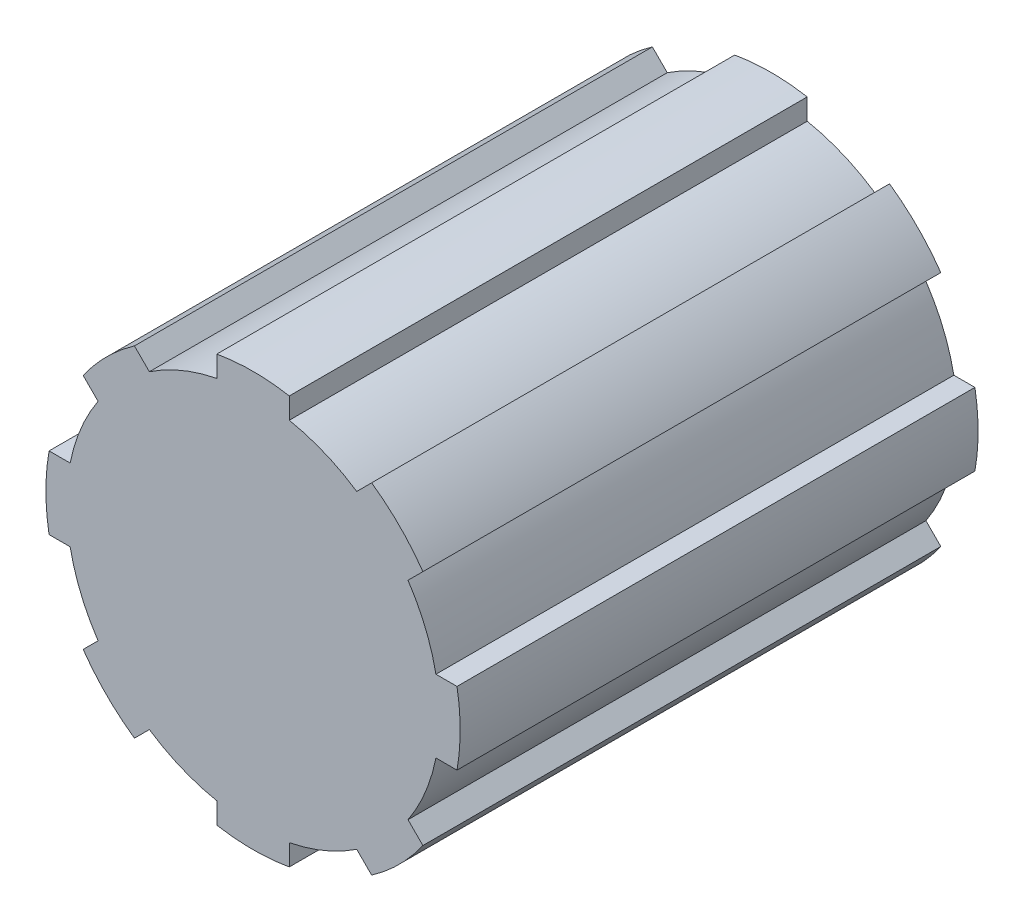
ISO-10303-21;
HEADER;
FILE_DESCRIPTION(('STEP AP214'),'2;1');
FILE_NAME('part.step','',(''),(''),'','','');
FILE_SCHEMA(('AUTOMOTIVE_DESIGN { 1 0 10303 214 1 1 1 1 }'));
ENDSEC;
DATA;
#1=APPLICATION_CONTEXT('core data for automotive mechanical design processes');
#2=APPLICATION_PROTOCOL_DEFINITION('international standard','automotive_design',2000,#1);
#3=PRODUCT_CONTEXT('',#1,'mechanical');
#4=PRODUCT('Part','Part','',(#3));
#5=PRODUCT_RELATED_PRODUCT_CATEGORY('part','',(#4));
#6=PRODUCT_DEFINITION_FORMATION('','',#4);
#7=PRODUCT_DEFINITION_CONTEXT('part definition',#1,'design');
#8=PRODUCT_DEFINITION('design','',#6,#7);
#9=PRODUCT_DEFINITION_SHAPE('','',#8);
#10=(LENGTH_UNIT() NAMED_UNIT(*) SI_UNIT(.MILLI.,.METRE.));
#11=(NAMED_UNIT(*) PLANE_ANGLE_UNIT() SI_UNIT($,.RADIAN.));
#12=(NAMED_UNIT(*) SI_UNIT($,.STERADIAN.) SOLID_ANGLE_UNIT());
#13=UNCERTAINTY_MEASURE_WITH_UNIT(LENGTH_MEASURE(1.E-05),#10,'distance_accuracy_value','');
#14=(GEOMETRIC_REPRESENTATION_CONTEXT(3) GLOBAL_UNCERTAINTY_ASSIGNED_CONTEXT((#13)) GLOBAL_UNIT_ASSIGNED_CONTEXT((#10,
#11,#12)) REPRESENTATION_CONTEXT('',''));
#15=CARTESIAN_POINT('',(0.,0.,0.));
#16=DIRECTION('',(0.,0.,1.));
#17=DIRECTION('',(1.,0.,0.));
#18=AXIS2_PLACEMENT_3D('',#15,#16,#17);
#19=CARTESIAN_POINT('',(0.,0.,-25.));
#20=DIRECTION('',(0.,0.,1.));
#21=DIRECTION('',(1.,0.,0.));
#22=AXIS2_PLACEMENT_3D('',#19,#20,#21);
#23=PLANE('',#22);
#24=CARTESIAN_POINT('',(0.,0.,-25.));
#25=DIRECTION('',(0.,0.,1.));
#26=DIRECTION('',(1.,0.,0.));
#27=AXIS2_PLACEMENT_3D('',#24,#25,#26);
#28=CIRCLE('',#27,18.);
#29=CARTESIAN_POINT('',(10.0101172550309,14.9598647233367,-25.));
#30=VERTEX_POINT('',#29);
#31=CARTESIAN_POINT('',(3.5,17.6564435830096,-25.));
#32=VERTEX_POINT('',#31);
#33=EDGE_CURVE('E527',#30,#32,#28,.T.);
#34=ORIENTED_EDGE('',*,*,#33,.F.);
#35=DIRECTION('',(-0.707106781186549,-0.707106781186546,0.));
#36=VECTOR('',#35,1.);
#37=CARTESIAN_POINT('',(11.4490265814914,16.3987740497972,-25.));
#38=LINE('',#37,#36);
#39=CARTESIAN_POINT('',(11.4490265814914,16.3987740497972,-25.));
#40=VERTEX_POINT('',#39);
#41=EDGE_CURVE('E450',#40,#30,#38,.T.);
#42=ORIENTED_EDGE('',*,*,#41,.F.);
#43=CARTESIAN_POINT('',(0.,0.,-25.));
#44=DIRECTION('',(0.,0.,1.));
#45=DIRECTION('',(0.707106781186546,-0.707106781186549,0.));
#46=AXIS2_PLACEMENT_3D('',#43,#44,#45);
#47=CIRCLE('',#46,20.);
#48=CARTESIAN_POINT('',(16.3987740497973,11.4490265814914,-25.));
#49=VERTEX_POINT('',#48);
#50=EDGE_CURVE('E437',#49,#40,#47,.T.);
#51=ORIENTED_EDGE('',*,*,#50,.F.);
#52=DIRECTION('',(0.707106781186549,0.707106781186546,0.));
#53=VECTOR('',#52,1.);
#54=CARTESIAN_POINT('',(2.47487373415291,-2.47487373415292,-25.));
#55=LINE('',#54,#53);
#56=CARTESIAN_POINT('',(14.9598647233367,10.0101172550308,-25.));
#57=VERTEX_POINT('',#56);
#58=EDGE_CURVE('E442',#57,#49,#55,.T.);
#59=ORIENTED_EDGE('',*,*,#58,.F.);
#60=CARTESIAN_POINT('',(17.6564435830096,3.49999999999994,-25.));
#61=VERTEX_POINT('',#60);
#62=EDGE_CURVE('E530',#61,#57,#28,.T.);
#63=ORIENTED_EDGE('',*,*,#62,.F.);
#64=DIRECTION('',(-1.,0.,0.));
#65=VECTOR('',#64,1.);
#66=CARTESIAN_POINT('',(19.6913686675152,3.49999999999993,-25.));
#67=LINE('',#66,#65);
#68=CARTESIAN_POINT('',(19.6913686675152,3.49999999999993,-25.));
#69=VERTEX_POINT('',#68);
#70=EDGE_CURVE('E428',#69,#61,#67,.T.);
#71=ORIENTED_EDGE('',*,*,#70,.F.);
#72=CARTESIAN_POINT('',(0.,0.,-25.));
#73=DIRECTION('',(0.,0.,1.));
#74=DIRECTION('',(0.,-1.,0.));
#75=AXIS2_PLACEMENT_3D('',#72,#73,#74);
#76=CIRCLE('',#75,20.);
#77=CARTESIAN_POINT('',(19.6913686675152,-3.50000000000007,-25.));
#78=VERTEX_POINT('',#77);
#79=EDGE_CURVE('E415',#78,#69,#76,.T.);
#80=ORIENTED_EDGE('',*,*,#79,.F.);
#81=DIRECTION('',(1.,0.,0.));
#82=VECTOR('',#81,1.);
#83=CARTESIAN_POINT('',(0.,-3.5,-25.));
#84=LINE('',#83,#82);
#85=CARTESIAN_POINT('',(17.6564435830096,-3.50000000000006,-25.));
#86=VERTEX_POINT('',#85);
#87=EDGE_CURVE('E420',#86,#78,#84,.T.);
#88=ORIENTED_EDGE('',*,*,#87,.F.);
#89=CARTESIAN_POINT('',(14.9598647233366,-10.0101172550309,-25.));
#90=VERTEX_POINT('',#89);
#91=EDGE_CURVE('E531',#90,#86,#28,.T.);
#92=ORIENTED_EDGE('',*,*,#91,.F.);
#93=DIRECTION('',(-0.707106781186544,0.707106781186551,0.));
#94=VECTOR('',#93,1.);
#95=CARTESIAN_POINT('',(16.3987740497972,-11.4490265814915,-25.));
#96=LINE('',#95,#94);
#97=CARTESIAN_POINT('',(16.3987740497972,-11.4490265814915,-25.));
#98=VERTEX_POINT('',#97);
#99=EDGE_CURVE('E406',#98,#90,#96,.T.);
#100=ORIENTED_EDGE('',*,*,#99,.F.);
#101=CARTESIAN_POINT('',(0.,0.,-25.));
#102=DIRECTION('',(0.,0.,1.));
#103=DIRECTION('',(-0.707106781186551,-0.707106781186544,0.));
#104=AXIS2_PLACEMENT_3D('',#101,#102,#103);
#105=CIRCLE('',#104,20.);
#106=CARTESIAN_POINT('',(11.4490265814913,-16.3987740497973,-25.));
#107=VERTEX_POINT('',#106);
#108=EDGE_CURVE('E391',#107,#98,#105,.T.);
#109=ORIENTED_EDGE('',*,*,#108,.F.);
#110=DIRECTION('',(0.707106781186544,-0.707106781186551,0.));
#111=VECTOR('',#110,1.);
#112=CARTESIAN_POINT('',(-2.47487373415293,-2.4748737341529,-25.));
#113=LINE('',#112,#111);
#114=CARTESIAN_POINT('',(10.0101172550308,-14.9598647233367,-25.));
#115=VERTEX_POINT('',#114);
#116=EDGE_CURVE('E396',#115,#107,#113,.T.);
#117=ORIENTED_EDGE('',*,*,#116,.F.);
#118=CARTESIAN_POINT('',(3.49999999999988,-17.6564435830096,-25.));
#119=VERTEX_POINT('',#118);
#120=EDGE_CURVE('E541',#119,#115,#28,.T.);
#121=ORIENTED_EDGE('',*,*,#120,.F.);
#122=DIRECTION('',(0.,1.,0.));
#123=VECTOR('',#122,1.);
#124=CARTESIAN_POINT('',(3.49999999999986,-19.6913686675152,-25.));
#125=LINE('',#124,#123);
#126=CARTESIAN_POINT('',(3.49999999999986,-19.6913686675152,-25.));
#127=VERTEX_POINT('',#126);
#128=EDGE_CURVE('E382',#127,#119,#125,.T.);
#129=ORIENTED_EDGE('',*,*,#128,.F.);
#130=CARTESIAN_POINT('',(0.,0.,-25.));
#131=DIRECTION('',(0.,0.,1.));
#132=DIRECTION('',(-1.,0.,0.));
#133=AXIS2_PLACEMENT_3D('',#130,#131,#132);
#134=CIRCLE('',#133,20.);
#135=CARTESIAN_POINT('',(-3.50000000000014,-19.6913686675152,-25.));
#136=VERTEX_POINT('',#135);
#137=EDGE_CURVE('E369',#136,#127,#134,.T.);
#138=ORIENTED_EDGE('',*,*,#137,.F.);
#139=DIRECTION('',(0.,-1.,0.));
#140=VECTOR('',#139,1.);
#141=CARTESIAN_POINT('',(-3.5,0.,-25.));
#142=LINE('',#141,#140);
#143=CARTESIAN_POINT('',(-3.50000000000012,-17.6564435830096,-25.));
#144=VERTEX_POINT('',#143);
#145=EDGE_CURVE('E374',#144,#136,#142,.T.);
#146=ORIENTED_EDGE('',*,*,#145,.F.);
#147=CARTESIAN_POINT('',(-10.010117255031,-14.9598647233366,-25.));
#148=VERTEX_POINT('',#147);
#149=EDGE_CURVE('E538',#148,#144,#28,.T.);
#150=ORIENTED_EDGE('',*,*,#149,.F.);
#151=DIRECTION('',(0.707106781186554,0.707106781186541,0.));
#152=VECTOR('',#151,1.);
#153=CARTESIAN_POINT('',(-11.4490265814915,-16.3987740497971,-25.));
#154=LINE('',#153,#152);
#155=CARTESIAN_POINT('',(-11.4490265814915,-16.3987740497971,-25.));
#156=VERTEX_POINT('',#155);
#157=EDGE_CURVE('E360',#156,#148,#154,.T.);
#158=ORIENTED_EDGE('',*,*,#157,.F.);
#159=CARTESIAN_POINT('',(0.,0.,-25.));
#160=DIRECTION('',(0.,0.,1.));
#161=DIRECTION('',(-0.707106781186541,0.707106781186554,0.));
#162=AXIS2_PLACEMENT_3D('',#159,#160,#161);
#163=CIRCLE('',#162,20.);
#164=CARTESIAN_POINT('',(-16.3987740497973,-11.4490265814913,-25.));
#165=VERTEX_POINT('',#164);
#166=EDGE_CURVE('E347',#165,#156,#163,.T.);
#167=ORIENTED_EDGE('',*,*,#166,.F.);
#168=DIRECTION('',(-0.707106781186554,-0.707106781186541,0.));
#169=VECTOR('',#168,1.);
#170=CARTESIAN_POINT('',(-2.4748737341529,2.47487373415294,-25.));
#171=LINE('',#170,#169);
#172=CARTESIAN_POINT('',(-14.9598647233368,-10.0101172550307,-25.));
#173=VERTEX_POINT('',#172);
#174=EDGE_CURVE('E352',#173,#165,#171,.T.);
#175=ORIENTED_EDGE('',*,*,#174,.F.);
#176=CARTESIAN_POINT('',(-17.6564435830096,-3.49999999999982,-25.));
#177=VERTEX_POINT('',#176);
#178=EDGE_CURVE('E535',#177,#173,#28,.T.);
#179=ORIENTED_EDGE('',*,*,#178,.F.);
#180=DIRECTION('',(1.,0.,0.));
#181=VECTOR('',#180,1.);
#182=CARTESIAN_POINT('',(-19.6913686675153,-3.49999999999979,-25.));
#183=LINE('',#182,#181);
#184=CARTESIAN_POINT('',(-19.6913686675153,-3.49999999999979,-25.));
#185=VERTEX_POINT('',#184);
#186=EDGE_CURVE('E338',#185,#177,#183,.T.);
#187=ORIENTED_EDGE('',*,*,#186,.F.);
#188=CARTESIAN_POINT('',(0.,0.,-25.));
#189=DIRECTION('',(0.,0.,1.));
#190=DIRECTION('',(0.,1.,0.));
#191=AXIS2_PLACEMENT_3D('',#188,#189,#190);
#192=CIRCLE('',#191,20.);
#193=CARTESIAN_POINT('',(-19.6913686675152,3.50000000000021,-25.));
#194=VERTEX_POINT('',#193);
#195=EDGE_CURVE('E325',#194,#185,#192,.T.);
#196=ORIENTED_EDGE('',*,*,#195,.F.);
#197=DIRECTION('',(-1.,0.,0.));
#198=VECTOR('',#197,1.);
#199=CARTESIAN_POINT('',(0.,3.5,-25.));
#200=LINE('',#199,#198);
#201=CARTESIAN_POINT('',(-17.6564435830095,3.50000000000019,-25.));
#202=VERTEX_POINT('',#201);
#203=EDGE_CURVE('E330',#202,#194,#200,.T.);
#204=ORIENTED_EDGE('',*,*,#203,.F.);
#205=CARTESIAN_POINT('',(-14.9598647233366,10.010117255031,-25.));
#206=VERTEX_POINT('',#205);
#207=EDGE_CURVE('E532',#206,#202,#28,.T.);
#208=ORIENTED_EDGE('',*,*,#207,.F.);
#209=DIRECTION('',(0.707106781186539,-0.707106781186556,0.));
#210=VECTOR('',#209,1.);
#211=CARTESIAN_POINT('',(-16.3987740497971,11.4490265814916,-25.));
#212=LINE('',#211,#210);
#213=CARTESIAN_POINT('',(-16.3987740497971,11.4490265814916,-25.));
#214=VERTEX_POINT('',#213);
#215=EDGE_CURVE('E312',#214,#206,#212,.T.);
#216=ORIENTED_EDGE('',*,*,#215,.F.);
#217=CARTESIAN_POINT('',(0.,0.,-25.));
#218=DIRECTION('',(0.,0.,1.));
#219=DIRECTION('',(0.707106781186556,0.707106781186539,0.));
#220=AXIS2_PLACEMENT_3D('',#217,#218,#219);
#221=CIRCLE('',#220,20.);
#222=CARTESIAN_POINT('',(-11.4490265814912,16.3987740497974,-25.));
#223=VERTEX_POINT('',#222);
#224=EDGE_CURVE('E305',#223,#214,#221,.T.);
#225=ORIENTED_EDGE('',*,*,#224,.F.);
#226=CARTESIAN_POINT('',(-10.0101172550308,14.9598647233367,-25.));
#227=VERTEX_POINT('',#226);
#228=EDGE_CURVE('E405',#227,#223,#96,.T.);
#229=ORIENTED_EDGE('',*,*,#228,.F.);
#230=CARTESIAN_POINT('',(-3.5,17.6564435830096,-25.));
#231=VERTEX_POINT('',#230);
#232=EDGE_CURVE('E36',#231,#227,#28,.T.);
#233=ORIENTED_EDGE('',*,*,#232,.F.);
#234=DIRECTION('',(0.,-1.,0.));
#235=VECTOR('',#234,1.);
#236=CARTESIAN_POINT('',(-3.5,19.6913686675152,-25.));
#237=LINE('',#236,#235);
#238=CARTESIAN_POINT('',(-3.5,19.6913686675152,-25.));
#239=VERTEX_POINT('',#238);
#240=EDGE_CURVE('E513',#239,#231,#237,.T.);
#241=ORIENTED_EDGE('',*,*,#240,.F.);
#242=CARTESIAN_POINT('',(0.,0.,-25.));
#243=DIRECTION('',(0.,0.,1.));
#244=DIRECTION('',(1.,0.,0.));
#245=AXIS2_PLACEMENT_3D('',#242,#243,#244);
#246=CIRCLE('',#245,20.);
#247=CARTESIAN_POINT('',(3.5,19.6913686675152,-25.));
#248=VERTEX_POINT('',#247);
#249=EDGE_CURVE('E500',#248,#239,#246,.T.);
#250=ORIENTED_EDGE('',*,*,#249,.F.);
#251=DIRECTION('',(0.,1.,0.));
#252=VECTOR('',#251,1.);
#253=CARTESIAN_POINT('',(3.5,0.,-25.));
#254=LINE('',#253,#252);
#255=EDGE_CURVE('E505',#32,#248,#254,.T.);
#256=ORIENTED_EDGE('',*,*,#255,.F.);
#257=EDGE_LOOP('',(#34,#42,#51,#59,#63,#71,#80,#88,#92,#100,#109,#117,#121,#129,#138,#146,#150,
#158,#167,#175,#179,#187,#196,#204,#208,#216,#225,#229,#233,#241,#250,#256));
#258=FACE_BOUND('',#257,.T.);
#259=DIRECTION('',(0.,-1.,0.));
#260=VECTOR('',#259,1.);
#261=CARTESIAN_POINT('',(-5.,14.,-25.));
#262=LINE('',#261,#260);
#263=CARTESIAN_POINT('',(-5.,14.,-25.));
#264=VERTEX_POINT('',#263);
#265=CARTESIAN_POINT('',(-5.,8.66025403784439,-25.));
#266=VERTEX_POINT('',#265);
#267=EDGE_CURVE('E272',#264,#266,#262,.T.);
#268=ORIENTED_EDGE('',*,*,#267,.T.);
#269=CARTESIAN_POINT('',(0.,0.,-25.));
#270=DIRECTION('',(0.,0.,-1.));
#271=DIRECTION('',(-1.,0.,0.));
#272=AXIS2_PLACEMENT_3D('',#269,#270,#271);
#273=CIRCLE('',#272,10.);
#274=CARTESIAN_POINT('',(5.,8.66025403784439,-25.));
#275=VERTEX_POINT('',#274);
#276=EDGE_CURVE('E303',#275,#266,#273,.T.);
#277=ORIENTED_EDGE('',*,*,#276,.F.);
#278=DIRECTION('',(0.,-1.,0.));
#279=VECTOR('',#278,1.);
#280=CARTESIAN_POINT('',(5.,14.,-25.));
#281=LINE('',#280,#279);
#282=CARTESIAN_POINT('',(5.,14.,-25.));
#283=VERTEX_POINT('',#282);
#284=EDGE_CURVE('E49',#283,#275,#281,.T.);
#285=ORIENTED_EDGE('',*,*,#284,.F.);
#286=DIRECTION('',(-1.,0.,0.));
#287=VECTOR('',#286,1.);
#288=CARTESIAN_POINT('',(5.,14.,-25.));
#289=LINE('',#288,#287);
#290=EDGE_CURVE('E293',#283,#264,#289,.T.);
#291=ORIENTED_EDGE('',*,*,#290,.T.);
#292=EDGE_LOOP('',(#268,#277,#285,#291));
#293=FACE_BOUND('',#292,.T.);
#294=ADVANCED_FACE('F32',(#258,#293),#23,.F.);
#295=CARTESIAN_POINT('',(0.,0.,-3.));
#296=DIRECTION('',(0.,0.,-1.));
#297=DIRECTION('',(-1.,0.,0.));
#298=AXIS2_PLACEMENT_3D('',#295,#296,#297);
#299=CYLINDRICAL_SURFACE('',#298,10.);
#300=DIRECTION('',(0.,0.,-1.));
#301=VECTOR('',#300,1.);
#302=CARTESIAN_POINT('',(-5.,8.66025403784439,-3.));
#303=LINE('',#302,#301);
#304=CARTESIAN_POINT('',(-5.,8.66025403784439,-3.));
#305=VERTEX_POINT('',#304);
#306=EDGE_CURVE('E301',#305,#266,#303,.T.);
#307=ORIENTED_EDGE('',*,*,#306,.F.);
#308=CARTESIAN_POINT('',(0.,0.,-3.));
#309=DIRECTION('',(0.,0.,-1.));
#310=DIRECTION('',(-1.,0.,0.));
#311=AXIS2_PLACEMENT_3D('',#308,#309,#310);
#312=CIRCLE('',#311,10.);
#313=CARTESIAN_POINT('',(5.00000000000001,8.66025403784439,-3.));
#314=VERTEX_POINT('',#313);
#315=EDGE_CURVE('E285',#314,#305,#312,.T.);
#316=ORIENTED_EDGE('',*,*,#315,.F.);
#317=DIRECTION('',(0.,0.,-1.));
#318=VECTOR('',#317,1.);
#319=CARTESIAN_POINT('',(5.,8.66025403784439,-3.));
#320=LINE('',#319,#318);
#321=EDGE_CURVE('E286',#275,#314,#320,.F.);
#322=ORIENTED_EDGE('',*,*,#321,.F.);
#323=ORIENTED_EDGE('',*,*,#276,.T.);
#324=EDGE_LOOP('',(#307,#316,#322,#323));
#325=FACE_BOUND('',#324,.T.);
#326=ADVANCED_FACE('F585',(#325),#299,.F.);
#327=CARTESIAN_POINT('',(0.,0.,25.));
#328=DIRECTION('',(0.,0.,-1.));
#329=DIRECTION('',(-1.,0.,0.));
#330=AXIS2_PLACEMENT_3D('',#327,#328,#329);
#331=CYLINDRICAL_SURFACE('',#330,18.);
#332=DIRECTION('',(0.,0.,-1.));
#333=VECTOR('',#332,1.);
#334=CARTESIAN_POINT('',(10.0101172550309,14.9598647233367,25.));
#335=LINE('',#334,#333);
#336=CARTESIAN_POINT('',(10.0101172550309,14.9598647233367,25.));
#337=VERTEX_POINT('',#336);
#338=EDGE_CURVE('E498',#30,#337,#335,.F.);
#339=ORIENTED_EDGE('',*,*,#338,.F.);
#340=ORIENTED_EDGE('',*,*,#33,.T.);
#341=DIRECTION('',(0.,0.,-1.));
#342=VECTOR('',#341,1.);
#343=CARTESIAN_POINT('',(3.5,17.6564435830096,25.));
#344=LINE('',#343,#342);
#345=CARTESIAN_POINT('',(3.5,17.6564435830096,25.));
#346=VERTEX_POINT('',#345);
#347=EDGE_CURVE('E522',#346,#32,#344,.T.);
#348=ORIENTED_EDGE('',*,*,#347,.F.);
#349=CARTESIAN_POINT('',(0.,0.,25.));
#350=DIRECTION('',(0.,0.,1.));
#351=DIRECTION('',(1.,0.,0.));
#352=AXIS2_PLACEMENT_3D('',#349,#350,#351);
#353=CIRCLE('',#352,18.);
#354=EDGE_CURVE('E42',#337,#346,#353,.T.);
#355=ORIENTED_EDGE('',*,*,#354,.F.);
#356=EDGE_LOOP('',(#339,#340,#348,#355));
#357=FACE_BOUND('',#356,.T.);
#358=ADVANCED_FACE('F34',(#357),#331,.T.);
#359=DIRECTION('',(0.,0.,-1.));
#360=VECTOR('',#359,1.);
#361=CARTESIAN_POINT('',(14.9598647233367,10.0101172550308,25.));
#362=LINE('',#361,#360);
#363=CARTESIAN_POINT('',(14.9598647233367,10.0101172550308,25.));
#364=VERTEX_POINT('',#363);
#365=EDGE_CURVE('E495',#364,#57,#362,.T.);
#366=ORIENTED_EDGE('',*,*,#365,.F.);
#367=CARTESIAN_POINT('',(17.6564435830096,3.49999999999994,25.));
#368=VERTEX_POINT('',#367);
#369=EDGE_CURVE('E534',#368,#364,#353,.T.);
#370=ORIENTED_EDGE('',*,*,#369,.F.);
#371=DIRECTION('',(0.,0.,-1.));
#372=VECTOR('',#371,1.);
#373=CARTESIAN_POINT('',(17.6564435830096,3.49999999999994,25.));
#374=LINE('',#373,#372);
#375=EDGE_CURVE('E492',#61,#368,#374,.F.);
#376=ORIENTED_EDGE('',*,*,#375,.F.);
#377=ORIENTED_EDGE('',*,*,#62,.T.);
#378=EDGE_LOOP('',(#366,#370,#376,#377));
#379=FACE_BOUND('',#378,.T.);
#380=ADVANCED_FACE('F584',(#379),#331,.T.);
#381=DIRECTION('',(0.,0.,-1.));
#382=VECTOR('',#381,1.);
#383=CARTESIAN_POINT('',(-10.0101172550308,14.9598647233367,25.));
#384=LINE('',#383,#382);
#385=CARTESIAN_POINT('',(-10.0101172550308,14.9598647233367,25.));
#386=VERTEX_POINT('',#385);
#387=EDGE_CURVE('E489',#386,#227,#384,.T.);
#388=ORIENTED_EDGE('',*,*,#387,.F.);
#389=CARTESIAN_POINT('',(-3.5,17.6564435830096,25.));
#390=VERTEX_POINT('',#389);
#391=EDGE_CURVE('E11',#390,#386,#353,.T.);
#392=ORIENTED_EDGE('',*,*,#391,.F.);
#393=DIRECTION('',(0.,0.,-1.));
#394=VECTOR('',#393,1.);
#395=CARTESIAN_POINT('',(-3.5,17.6564435830096,25.));
#396=LINE('',#395,#394);
#397=EDGE_CURVE('E525',#231,#390,#396,.F.);
#398=ORIENTED_EDGE('',*,*,#397,.F.);
#399=ORIENTED_EDGE('',*,*,#232,.T.);
#400=EDGE_LOOP('',(#388,#392,#398,#399));
#401=FACE_BOUND('',#400,.T.);
#402=ADVANCED_FACE('F590',(#401),#331,.T.);
#403=DIRECTION('',(0.,0.,-1.));
#404=VECTOR('',#403,1.);
#405=CARTESIAN_POINT('',(17.6564435830096,-3.50000000000006,25.));
#406=LINE('',#405,#404);
#407=CARTESIAN_POINT('',(17.6564435830096,-3.50000000000006,25.));
#408=VERTEX_POINT('',#407);
#409=EDGE_CURVE('E486',#408,#86,#406,.T.);
#410=ORIENTED_EDGE('',*,*,#409,.F.);
#411=CARTESIAN_POINT('',(14.9598647233366,-10.0101172550309,25.));
#412=VERTEX_POINT('',#411);
#413=EDGE_CURVE('E566',#412,#408,#353,.T.);
#414=ORIENTED_EDGE('',*,*,#413,.F.);
#415=DIRECTION('',(0.,0.,-1.));
#416=VECTOR('',#415,1.);
#417=CARTESIAN_POINT('',(14.9598647233366,-10.0101172550309,25.));
#418=LINE('',#417,#416);
#419=EDGE_CURVE('E483',#90,#412,#418,.F.);
#420=ORIENTED_EDGE('',*,*,#419,.F.);
#421=ORIENTED_EDGE('',*,*,#91,.T.);
#422=EDGE_LOOP('',(#410,#414,#420,#421));
#423=FACE_BOUND('',#422,.T.);
#424=ADVANCED_FACE('F548',(#423),#331,.T.);
#425=DIRECTION('',(0.,0.,-1.));
#426=VECTOR('',#425,1.);
#427=CARTESIAN_POINT('',(10.0101172550308,-14.9598647233367,25.));
#428=LINE('',#427,#426);
#429=CARTESIAN_POINT('',(10.0101172550308,-14.9598647233367,25.));
#430=VERTEX_POINT('',#429);
#431=EDGE_CURVE('E480',#430,#115,#428,.T.);
#432=ORIENTED_EDGE('',*,*,#431,.F.);
#433=CARTESIAN_POINT('',(3.49999999999988,-17.6564435830096,25.));
#434=VERTEX_POINT('',#433);
#435=EDGE_CURVE('E567',#434,#430,#353,.T.);
#436=ORIENTED_EDGE('',*,*,#435,.F.);
#437=DIRECTION('',(0.,0.,-1.));
#438=VECTOR('',#437,1.);
#439=CARTESIAN_POINT('',(3.49999999999988,-17.6564435830096,25.));
#440=LINE('',#439,#438);
#441=EDGE_CURVE('E477',#119,#434,#440,.F.);
#442=ORIENTED_EDGE('',*,*,#441,.F.);
#443=ORIENTED_EDGE('',*,*,#120,.T.);
#444=EDGE_LOOP('',(#432,#436,#442,#443));
#445=FACE_BOUND('',#444,.T.);
#446=ADVANCED_FACE('F834',(#445),#331,.T.);
#447=DIRECTION('',(0.,0.,-1.));
#448=VECTOR('',#447,1.);
#449=CARTESIAN_POINT('',(-3.50000000000012,-17.6564435830096,25.));
#450=LINE('',#449,#448);
#451=CARTESIAN_POINT('',(-3.50000000000012,-17.6564435830096,25.));
#452=VERTEX_POINT('',#451);
#453=EDGE_CURVE('E474',#452,#144,#450,.T.);
#454=ORIENTED_EDGE('',*,*,#453,.F.);
#455=CARTESIAN_POINT('',(-10.010117255031,-14.9598647233366,25.));
#456=VERTEX_POINT('',#455);
#457=EDGE_CURVE('E569',#456,#452,#353,.T.);
#458=ORIENTED_EDGE('',*,*,#457,.F.);
#459=DIRECTION('',(0.,0.,-1.));
#460=VECTOR('',#459,1.);
#461=CARTESIAN_POINT('',(-10.010117255031,-14.9598647233366,25.));
#462=LINE('',#461,#460);
#463=EDGE_CURVE('E471',#148,#456,#462,.F.);
#464=ORIENTED_EDGE('',*,*,#463,.F.);
#465=ORIENTED_EDGE('',*,*,#149,.T.);
#466=EDGE_LOOP('',(#454,#458,#464,#465));
#467=FACE_BOUND('',#466,.T.);
#468=ADVANCED_FACE('F828',(#467),#331,.T.);
#469=DIRECTION('',(0.,0.,-1.));
#470=VECTOR('',#469,1.);
#471=CARTESIAN_POINT('',(-14.9598647233368,-10.0101172550307,25.));
#472=LINE('',#471,#470);
#473=CARTESIAN_POINT('',(-14.9598647233368,-10.0101172550307,25.));
#474=VERTEX_POINT('',#473);
#475=EDGE_CURVE('E468',#474,#173,#472,.T.);
#476=ORIENTED_EDGE('',*,*,#475,.F.);
#477=CARTESIAN_POINT('',(-17.6564435830096,-3.49999999999982,25.));
#478=VERTEX_POINT('',#477);
#479=EDGE_CURVE('E972',#478,#474,#353,.T.);
#480=ORIENTED_EDGE('',*,*,#479,.F.);
#481=DIRECTION('',(0.,0.,-1.));
#482=VECTOR('',#481,1.);
#483=CARTESIAN_POINT('',(-17.6564435830096,-3.49999999999982,25.));
#484=LINE('',#483,#482);
#485=EDGE_CURVE('E465',#177,#478,#484,.F.);
#486=ORIENTED_EDGE('',*,*,#485,.F.);
#487=ORIENTED_EDGE('',*,*,#178,.T.);
#488=EDGE_LOOP('',(#476,#480,#486,#487));
#489=FACE_BOUND('',#488,.T.);
#490=ADVANCED_FACE('F595',(#489),#331,.T.);
#491=DIRECTION('',(0.,0.,-1.));
#492=VECTOR('',#491,1.);
#493=CARTESIAN_POINT('',(-17.6564435830095,3.50000000000019,25.));
#494=LINE('',#493,#492);
#495=CARTESIAN_POINT('',(-17.6564435830095,3.50000000000019,25.));
#496=VERTEX_POINT('',#495);
#497=EDGE_CURVE('E462',#496,#202,#494,.T.);
#498=ORIENTED_EDGE('',*,*,#497,.F.);
#499=CARTESIAN_POINT('',(-14.9598647233366,10.010117255031,25.));
#500=VERTEX_POINT('',#499);
#501=EDGE_CURVE('E41',#500,#496,#353,.T.);
#502=ORIENTED_EDGE('',*,*,#501,.F.);
#503=DIRECTION('',(0.,0.,-1.));
#504=VECTOR('',#503,1.);
#505=CARTESIAN_POINT('',(-14.9598647233366,10.010117255031,25.));
#506=LINE('',#505,#504);
#507=EDGE_CURVE('E459',#206,#500,#506,.F.);
#508=ORIENTED_EDGE('',*,*,#507,.F.);
#509=ORIENTED_EDGE('',*,*,#207,.T.);
#510=EDGE_LOOP('',(#498,#502,#508,#509));
#511=FACE_BOUND('',#510,.T.);
#512=ADVANCED_FACE('F586',(#511),#331,.T.);
#513=CARTESIAN_POINT('',(0.,0.,25.));
#514=DIRECTION('',(0.,0.,1.));
#515=DIRECTION('',(1.,0.,0.));
#516=AXIS2_PLACEMENT_3D('',#513,#514,#515);
#517=PLANE('',#516);
#518=ORIENTED_EDGE('',*,*,#369,.T.);
#519=DIRECTION('',(0.707106781186549,0.707106781186546,0.));
#520=VECTOR('',#519,1.);
#521=CARTESIAN_POINT('',(2.47487373415291,-2.47487373415292,25.));
#522=LINE('',#521,#520);
#523=CARTESIAN_POINT('',(16.3987740497973,11.4490265814914,25.));
#524=VERTEX_POINT('',#523);
#525=EDGE_CURVE('E445',#364,#524,#522,.T.);
#526=ORIENTED_EDGE('',*,*,#525,.T.);
#527=CARTESIAN_POINT('',(0.,0.,25.));
#528=DIRECTION('',(0.,0.,1.));
#529=DIRECTION('',(0.707106781186546,-0.707106781186549,0.));
#530=AXIS2_PLACEMENT_3D('',#527,#528,#529);
#531=CIRCLE('',#530,20.);
#532=CARTESIAN_POINT('',(11.4490265814914,16.3987740497972,25.));
#533=VERTEX_POINT('',#532);
#534=EDGE_CURVE('E438',#524,#533,#531,.T.);
#535=ORIENTED_EDGE('',*,*,#534,.T.);
#536=DIRECTION('',(-0.707106781186549,-0.707106781186546,0.));
#537=VECTOR('',#536,1.);
#538=CARTESIAN_POINT('',(11.4490265814914,16.3987740497972,25.));
#539=LINE('',#538,#537);
#540=EDGE_CURVE('E441',#533,#337,#539,.T.);
#541=ORIENTED_EDGE('',*,*,#540,.T.);
#542=ORIENTED_EDGE('',*,*,#354,.T.);
#543=DIRECTION('',(0.,1.,0.));
#544=VECTOR('',#543,1.);
#545=CARTESIAN_POINT('',(3.5,0.,25.));
#546=LINE('',#545,#544);
#547=CARTESIAN_POINT('',(3.5,19.6913686675152,25.));
#548=VERTEX_POINT('',#547);
#549=EDGE_CURVE('E508',#346,#548,#546,.T.);
#550=ORIENTED_EDGE('',*,*,#549,.T.);
#551=CARTESIAN_POINT('',(0.,0.,25.));
#552=DIRECTION('',(0.,0.,1.));
#553=DIRECTION('',(1.,0.,0.));
#554=AXIS2_PLACEMENT_3D('',#551,#552,#553);
#555=CIRCLE('',#554,20.);
#556=CARTESIAN_POINT('',(-3.5,19.6913686675152,25.));
#557=VERTEX_POINT('',#556);
#558=EDGE_CURVE('E501',#548,#557,#555,.T.);
#559=ORIENTED_EDGE('',*,*,#558,.T.);
#560=DIRECTION('',(0.,-1.,0.));
#561=VECTOR('',#560,1.);
#562=CARTESIAN_POINT('',(-3.5,19.6913686675152,25.));
#563=LINE('',#562,#561);
#564=EDGE_CURVE('E504',#557,#390,#563,.T.);
#565=ORIENTED_EDGE('',*,*,#564,.T.);
#566=ORIENTED_EDGE('',*,*,#391,.T.);
#567=DIRECTION('',(-0.707106781186544,0.707106781186551,0.));
#568=VECTOR('',#567,1.);
#569=CARTESIAN_POINT('',(16.3987740497972,-11.4490265814915,25.));
#570=LINE('',#569,#568);
#571=CARTESIAN_POINT('',(-11.4490265814912,16.3987740497974,25.));
#572=VERTEX_POINT('',#571);
#573=EDGE_CURVE('E395',#386,#572,#570,.T.);
#574=ORIENTED_EDGE('',*,*,#573,.T.);
#575=CARTESIAN_POINT('',(0.,0.,25.));
#576=DIRECTION('',(0.,0.,1.));
#577=DIRECTION('',(0.707106781186556,0.707106781186539,0.));
#578=AXIS2_PLACEMENT_3D('',#575,#576,#577);
#579=CIRCLE('',#578,20.);
#580=CARTESIAN_POINT('',(-16.3987740497971,11.4490265814916,25.));
#581=VERTEX_POINT('',#580);
#582=EDGE_CURVE('E308',#572,#581,#579,.T.);
#583=ORIENTED_EDGE('',*,*,#582,.T.);
#584=DIRECTION('',(0.707106781186539,-0.707106781186556,0.));
#585=VECTOR('',#584,1.);
#586=CARTESIAN_POINT('',(-16.3987740497971,11.4490265814916,25.));
#587=LINE('',#586,#585);
#588=EDGE_CURVE('E311',#581,#500,#587,.T.);
#589=ORIENTED_EDGE('',*,*,#588,.T.);
#590=ORIENTED_EDGE('',*,*,#501,.T.);
#591=DIRECTION('',(-1.,0.,0.));
#592=VECTOR('',#591,1.);
#593=CARTESIAN_POINT('',(0.,3.5,25.));
#594=LINE('',#593,#592);
#595=CARTESIAN_POINT('',(-19.6913686675152,3.50000000000021,25.));
#596=VERTEX_POINT('',#595);
#597=EDGE_CURVE('E333',#496,#596,#594,.T.);
#598=ORIENTED_EDGE('',*,*,#597,.T.);
#599=CARTESIAN_POINT('',(0.,0.,25.));
#600=DIRECTION('',(0.,0.,1.));
#601=DIRECTION('',(0.,1.,0.));
#602=AXIS2_PLACEMENT_3D('',#599,#600,#601);
#603=CIRCLE('',#602,20.);
#604=CARTESIAN_POINT('',(-19.6913686675153,-3.49999999999979,25.));
#605=VERTEX_POINT('',#604);
#606=EDGE_CURVE('E326',#596,#605,#603,.T.);
#607=ORIENTED_EDGE('',*,*,#606,.T.);
#608=DIRECTION('',(1.,0.,0.));
#609=VECTOR('',#608,1.);
#610=CARTESIAN_POINT('',(-19.6913686675153,-3.49999999999979,25.));
#611=LINE('',#610,#609);
#612=EDGE_CURVE('E329',#605,#478,#611,.T.);
#613=ORIENTED_EDGE('',*,*,#612,.T.);
#614=ORIENTED_EDGE('',*,*,#479,.T.);
#615=DIRECTION('',(-0.707106781186554,-0.707106781186541,0.));
#616=VECTOR('',#615,1.);
#617=CARTESIAN_POINT('',(-2.4748737341529,2.47487373415294,25.));
#618=LINE('',#617,#616);
#619=CARTESIAN_POINT('',(-16.3987740497973,-11.4490265814913,25.));
#620=VERTEX_POINT('',#619);
#621=EDGE_CURVE('E355',#474,#620,#618,.T.);
#622=ORIENTED_EDGE('',*,*,#621,.T.);
#623=CARTESIAN_POINT('',(0.,0.,25.));
#624=DIRECTION('',(0.,0.,1.));
#625=DIRECTION('',(-0.707106781186541,0.707106781186554,0.));
#626=AXIS2_PLACEMENT_3D('',#623,#624,#625);
#627=CIRCLE('',#626,20.);
#628=CARTESIAN_POINT('',(-11.4490265814915,-16.3987740497971,25.));
#629=VERTEX_POINT('',#628);
#630=EDGE_CURVE('E348',#620,#629,#627,.T.);
#631=ORIENTED_EDGE('',*,*,#630,.T.);
#632=DIRECTION('',(0.707106781186554,0.707106781186541,0.));
#633=VECTOR('',#632,1.);
#634=CARTESIAN_POINT('',(-11.4490265814915,-16.3987740497971,25.));
#635=LINE('',#634,#633);
#636=EDGE_CURVE('E351',#629,#456,#635,.T.);
#637=ORIENTED_EDGE('',*,*,#636,.T.);
#638=ORIENTED_EDGE('',*,*,#457,.T.);
#639=DIRECTION('',(0.,-1.,0.));
#640=VECTOR('',#639,1.);
#641=CARTESIAN_POINT('',(-3.5,0.,25.));
#642=LINE('',#641,#640);
#643=CARTESIAN_POINT('',(-3.50000000000014,-19.6913686675152,25.));
#644=VERTEX_POINT('',#643);
#645=EDGE_CURVE('E377',#452,#644,#642,.T.);
#646=ORIENTED_EDGE('',*,*,#645,.T.);
#647=CARTESIAN_POINT('',(0.,0.,25.));
#648=DIRECTION('',(0.,0.,1.));
#649=DIRECTION('',(-1.,0.,0.));
#650=AXIS2_PLACEMENT_3D('',#647,#648,#649);
#651=CIRCLE('',#650,20.);
#652=CARTESIAN_POINT('',(3.49999999999986,-19.6913686675152,25.));
#653=VERTEX_POINT('',#652);
#654=EDGE_CURVE('E370',#644,#653,#651,.T.);
#655=ORIENTED_EDGE('',*,*,#654,.T.);
#656=DIRECTION('',(0.,1.,0.));
#657=VECTOR('',#656,1.);
#658=CARTESIAN_POINT('',(3.49999999999986,-19.6913686675152,25.));
#659=LINE('',#658,#657);
#660=EDGE_CURVE('E373',#653,#434,#659,.T.);
#661=ORIENTED_EDGE('',*,*,#660,.T.);
#662=ORIENTED_EDGE('',*,*,#435,.T.);
#663=DIRECTION('',(0.707106781186544,-0.707106781186551,0.));
#664=VECTOR('',#663,1.);
#665=CARTESIAN_POINT('',(-2.47487373415293,-2.4748737341529,25.));
#666=LINE('',#665,#664);
#667=CARTESIAN_POINT('',(11.4490265814913,-16.3987740497973,25.));
#668=VERTEX_POINT('',#667);
#669=EDGE_CURVE('E400',#430,#668,#666,.T.);
#670=ORIENTED_EDGE('',*,*,#669,.T.);
#671=CARTESIAN_POINT('',(0.,0.,25.));
#672=DIRECTION('',(0.,0.,1.));
#673=DIRECTION('',(-0.707106781186551,-0.707106781186544,0.));
#674=AXIS2_PLACEMENT_3D('',#671,#672,#673);
#675=CIRCLE('',#674,20.);
#676=CARTESIAN_POINT('',(16.3987740497972,-11.4490265814915,25.));
#677=VERTEX_POINT('',#676);
#678=EDGE_CURVE('E392',#668,#677,#675,.T.);
#679=ORIENTED_EDGE('',*,*,#678,.T.);
#680=EDGE_CURVE('E397',#677,#412,#570,.T.);
#681=ORIENTED_EDGE('',*,*,#680,.T.);
#682=ORIENTED_EDGE('',*,*,#413,.T.);
#683=DIRECTION('',(1.,0.,0.));
#684=VECTOR('',#683,1.);
#685=CARTESIAN_POINT('',(0.,-3.5,25.));
#686=LINE('',#685,#684);
#687=CARTESIAN_POINT('',(19.6913686675152,-3.50000000000007,25.));
#688=VERTEX_POINT('',#687);
#689=EDGE_CURVE('E423',#408,#688,#686,.T.);
#690=ORIENTED_EDGE('',*,*,#689,.T.);
#691=CARTESIAN_POINT('',(0.,0.,25.));
#692=DIRECTION('',(0.,0.,1.));
#693=DIRECTION('',(0.,-1.,0.));
#694=AXIS2_PLACEMENT_3D('',#691,#692,#693);
#695=CIRCLE('',#694,20.);
#696=CARTESIAN_POINT('',(19.6913686675152,3.49999999999993,25.));
#697=VERTEX_POINT('',#696);
#698=EDGE_CURVE('E416',#688,#697,#695,.T.);
#699=ORIENTED_EDGE('',*,*,#698,.T.);
#700=DIRECTION('',(-1.,0.,0.));
#701=VECTOR('',#700,1.);
#702=CARTESIAN_POINT('',(19.6913686675152,3.49999999999993,25.));
#703=LINE('',#702,#701);
#704=EDGE_CURVE('E419',#697,#368,#703,.T.);
#705=ORIENTED_EDGE('',*,*,#704,.T.);
#706=EDGE_LOOP('',(#518,#526,#535,#541,#542,#550,#559,#565,#566,#574,#583,#589,#590,#598,#607,
#613,#614,#622,#631,#637,#638,#646,#655,#661,#662,#670,#679,#681,#682,#690,#699,#705));
#707=FACE_BOUND('',#706,.T.);
#708=ADVANCED_FACE('F565',(#707),#517,.T.);
#709=CARTESIAN_POINT('',(-3.5,19.6913686675152,25.));
#710=DIRECTION('',(1.,0.,0.));
#711=DIRECTION('',(0.,1.,0.));
#712=AXIS2_PLACEMENT_3D('',#709,#710,#711);
#713=PLANE('',#712);
#714=ORIENTED_EDGE('',*,*,#240,.T.);
#715=ORIENTED_EDGE('',*,*,#397,.T.);
#716=ORIENTED_EDGE('',*,*,#564,.F.);
#717=DIRECTION('',(0.,0.,-1.));
#718=VECTOR('',#717,1.);
#719=CARTESIAN_POINT('',(-3.5,19.6913686675152,25.));
#720=LINE('',#719,#718);
#721=EDGE_CURVE('E519',#557,#239,#720,.T.);
#722=ORIENTED_EDGE('',*,*,#721,.T.);
#723=EDGE_LOOP('',(#714,#715,#716,#722));
#724=FACE_BOUND('',#723,.T.);
#725=ADVANCED_FACE('F604',(#724),#713,.F.);
#726=CARTESIAN_POINT('',(3.5,0.,25.));
#727=DIRECTION('',(-1.,0.,0.));
#728=DIRECTION('',(0.,0.,1.));
#729=AXIS2_PLACEMENT_3D('',#726,#727,#728);
#730=PLANE('',#729);
#731=ORIENTED_EDGE('',*,*,#549,.F.);
#732=ORIENTED_EDGE('',*,*,#347,.T.);
#733=ORIENTED_EDGE('',*,*,#255,.T.);
#734=DIRECTION('',(0.,0.,-1.));
#735=VECTOR('',#734,1.);
#736=CARTESIAN_POINT('',(3.5,19.6913686675152,25.));
#737=LINE('',#736,#735);
#738=EDGE_CURVE('E510',#548,#248,#737,.T.);
#739=ORIENTED_EDGE('',*,*,#738,.F.);
#740=EDGE_LOOP('',(#731,#732,#733,#739));
#741=FACE_BOUND('',#740,.T.);
#742=ADVANCED_FACE('F609',(#741),#730,.F.);
#743=CARTESIAN_POINT('',(0.,0.,25.));
#744=DIRECTION('',(0.,0.,-1.));
#745=DIRECTION('',(-1.,0.,0.));
#746=AXIS2_PLACEMENT_3D('',#743,#744,#745);
#747=CYLINDRICAL_SURFACE('',#746,20.);
#748=ORIENTED_EDGE('',*,*,#249,.T.);
#749=ORIENTED_EDGE('',*,*,#721,.F.);
#750=ORIENTED_EDGE('',*,*,#558,.F.);
#751=ORIENTED_EDGE('',*,*,#738,.T.);
#752=EDGE_LOOP('',(#748,#749,#750,#751));
#753=FACE_BOUND('',#752,.T.);
#754=ADVANCED_FACE('F605',(#753),#747,.T.);
#755=CARTESIAN_POINT('',(0.,0.,25.));
#756=DIRECTION('',(0.,0.,-1.));
#757=DIRECTION('',(-1.,0.,0.));
#758=AXIS2_PLACEMENT_3D('',#755,#756,#757);
#759=CYLINDRICAL_SURFACE('',#758,20.);
#760=ORIENTED_EDGE('',*,*,#224,.T.);
#761=DIRECTION('',(0.,0.,-1.));
#762=VECTOR('',#761,1.);
#763=CARTESIAN_POINT('',(-16.3987740497971,11.4490265814916,25.));
#764=LINE('',#763,#762);
#765=EDGE_CURVE('E322',#581,#214,#764,.T.);
#766=ORIENTED_EDGE('',*,*,#765,.F.);
#767=ORIENTED_EDGE('',*,*,#582,.F.);
#768=DIRECTION('',(0.,0.,-1.));
#769=VECTOR('',#768,1.);
#770=CARTESIAN_POINT('',(-11.4490265814912,16.3987740497974,25.));
#771=LINE('',#770,#769);
#772=EDGE_CURVE('E315',#572,#223,#771,.T.);
#773=ORIENTED_EDGE('',*,*,#772,.T.);
#774=EDGE_LOOP('',(#760,#766,#767,#773));
#775=FACE_BOUND('',#774,.T.);
#776=ADVANCED_FACE('F608',(#775),#759,.T.);
#777=CARTESIAN_POINT('',(-16.3987740497971,11.4490265814916,25.));
#778=DIRECTION('',(0.707106781186556,0.707106781186539,0.));
#779=DIRECTION('',(-0.707106781186539,0.707106781186556,0.));
#780=AXIS2_PLACEMENT_3D('',#777,#778,#779);
#781=PLANE('',#780);
#782=ORIENTED_EDGE('',*,*,#215,.T.);
#783=ORIENTED_EDGE('',*,*,#507,.T.);
#784=ORIENTED_EDGE('',*,*,#588,.F.);
#785=ORIENTED_EDGE('',*,*,#765,.T.);
#786=EDGE_LOOP('',(#782,#783,#784,#785));
#787=FACE_BOUND('',#786,.T.);
#788=ADVANCED_FACE('F641',(#787),#781,.F.);
#789=CARTESIAN_POINT('',(16.3987740497972,-11.4490265814915,25.));
#790=DIRECTION('',(-0.707106781186551,-0.707106781186544,0.));
#791=DIRECTION('',(0.707106781186544,-0.707106781186551,0.));
#792=AXIS2_PLACEMENT_3D('',#789,#790,#791);
#793=PLANE('',#792);
#794=ORIENTED_EDGE('',*,*,#573,.F.);
#795=ORIENTED_EDGE('',*,*,#387,.T.);
#796=ORIENTED_EDGE('',*,*,#228,.T.);
#797=ORIENTED_EDGE('',*,*,#772,.F.);
#798=EDGE_LOOP('',(#794,#795,#796,#797));
#799=FACE_BOUND('',#798,.T.);
#800=ADVANCED_FACE('F637',(#799),#793,.F.);
#801=CARTESIAN_POINT('',(0.,0.,25.));
#802=DIRECTION('',(0.,0.,-1.));
#803=DIRECTION('',(-1.,0.,0.));
#804=AXIS2_PLACEMENT_3D('',#801,#802,#803);
#805=CYLINDRICAL_SURFACE('',#804,20.);
#806=ORIENTED_EDGE('',*,*,#195,.T.);
#807=DIRECTION('',(0.,0.,-1.));
#808=VECTOR('',#807,1.);
#809=CARTESIAN_POINT('',(-19.6913686675153,-3.49999999999979,25.));
#810=LINE('',#809,#808);
#811=EDGE_CURVE('E344',#605,#185,#810,.T.);
#812=ORIENTED_EDGE('',*,*,#811,.F.);
#813=ORIENTED_EDGE('',*,*,#606,.F.);
#814=DIRECTION('',(0.,0.,-1.));
#815=VECTOR('',#814,1.);
#816=CARTESIAN_POINT('',(-19.6913686675152,3.50000000000021,25.));
#817=LINE('',#816,#815);
#818=EDGE_CURVE('E335',#596,#194,#817,.T.);
#819=ORIENTED_EDGE('',*,*,#818,.T.);
#820=EDGE_LOOP('',(#806,#812,#813,#819));
#821=FACE_BOUND('',#820,.T.);
#822=ADVANCED_FACE('F640',(#821),#805,.T.);
#823=CARTESIAN_POINT('',(-19.6913686675153,-3.49999999999979,25.));
#824=DIRECTION('',(0.,1.,0.));
#825=DIRECTION('',(-1.,0.,0.));
#826=AXIS2_PLACEMENT_3D('',#823,#824,#825);
#827=PLANE('',#826);
#828=ORIENTED_EDGE('',*,*,#186,.T.);
#829=ORIENTED_EDGE('',*,*,#485,.T.);
#830=ORIENTED_EDGE('',*,*,#612,.F.);
#831=ORIENTED_EDGE('',*,*,#811,.T.);
#832=EDGE_LOOP('',(#828,#829,#830,#831));
#833=FACE_BOUND('',#832,.T.);
#834=ADVANCED_FACE('F672',(#833),#827,.F.);
#835=CARTESIAN_POINT('',(0.,3.5,25.));
#836=DIRECTION('',(0.,-1.,0.));
#837=DIRECTION('',(1.,0.,0.));
#838=AXIS2_PLACEMENT_3D('',#835,#836,#837);
#839=PLANE('',#838);
#840=ORIENTED_EDGE('',*,*,#597,.F.);
#841=ORIENTED_EDGE('',*,*,#497,.T.);
#842=ORIENTED_EDGE('',*,*,#203,.T.);
#843=ORIENTED_EDGE('',*,*,#818,.F.);
#844=EDGE_LOOP('',(#840,#841,#842,#843));
#845=FACE_BOUND('',#844,.T.);
#846=ADVANCED_FACE('F662',(#845),#839,.F.);
#847=CARTESIAN_POINT('',(0.,0.,25.));
#848=DIRECTION('',(0.,0.,-1.));
#849=DIRECTION('',(-1.,0.,0.));
#850=AXIS2_PLACEMENT_3D('',#847,#848,#849);
#851=CYLINDRICAL_SURFACE('',#850,20.);
#852=ORIENTED_EDGE('',*,*,#166,.T.);
#853=DIRECTION('',(0.,0.,-1.));
#854=VECTOR('',#853,1.);
#855=CARTESIAN_POINT('',(-11.4490265814915,-16.3987740497971,25.));
#856=LINE('',#855,#854);
#857=EDGE_CURVE('E366',#629,#156,#856,.T.);
#858=ORIENTED_EDGE('',*,*,#857,.F.);
#859=ORIENTED_EDGE('',*,*,#630,.F.);
#860=DIRECTION('',(0.,0.,-1.));
#861=VECTOR('',#860,1.);
#862=CARTESIAN_POINT('',(-16.3987740497973,-11.4490265814913,25.));
#863=LINE('',#862,#861);
#864=EDGE_CURVE('E357',#620,#165,#863,.T.);
#865=ORIENTED_EDGE('',*,*,#864,.T.);
#866=EDGE_LOOP('',(#852,#858,#859,#865));
#867=FACE_BOUND('',#866,.T.);
#868=ADVANCED_FACE('F658',(#867),#851,.T.);
#869=CARTESIAN_POINT('',(-11.4490265814915,-16.3987740497971,25.));
#870=DIRECTION('',(-0.707106781186542,0.707106781186554,0.));
#871=DIRECTION('',(-0.707106781186554,-0.707106781186542,0.));
#872=AXIS2_PLACEMENT_3D('',#869,#870,#871);
#873=PLANE('',#872);
#874=ORIENTED_EDGE('',*,*,#157,.T.);
#875=ORIENTED_EDGE('',*,*,#463,.T.);
#876=ORIENTED_EDGE('',*,*,#636,.F.);
#877=ORIENTED_EDGE('',*,*,#857,.T.);
#878=EDGE_LOOP('',(#874,#875,#876,#877));
#879=FACE_BOUND('',#878,.T.);
#880=ADVANCED_FACE('F661',(#879),#873,.F.);
#881=CARTESIAN_POINT('',(-2.4748737341529,2.47487373415294,25.));
#882=DIRECTION('',(0.707106781186541,-0.707106781186554,0.));
#883=DIRECTION('',(0.707106781186554,0.707106781186541,0.));
#884=AXIS2_PLACEMENT_3D('',#881,#882,#883);
#885=PLANE('',#884);
#886=ORIENTED_EDGE('',*,*,#621,.F.);
#887=ORIENTED_EDGE('',*,*,#475,.T.);
#888=ORIENTED_EDGE('',*,*,#174,.T.);
#889=ORIENTED_EDGE('',*,*,#864,.F.);
#890=EDGE_LOOP('',(#886,#887,#888,#889));
#891=FACE_BOUND('',#890,.T.);
#892=ADVANCED_FACE('F650',(#891),#885,.F.);
#893=CARTESIAN_POINT('',(0.,0.,25.));
#894=DIRECTION('',(0.,0.,-1.));
#895=DIRECTION('',(-1.,0.,0.));
#896=AXIS2_PLACEMENT_3D('',#893,#894,#895);
#897=CYLINDRICAL_SURFACE('',#896,20.);
#898=ORIENTED_EDGE('',*,*,#137,.T.);
#899=DIRECTION('',(0.,0.,-1.));
#900=VECTOR('',#899,1.);
#901=CARTESIAN_POINT('',(3.49999999999986,-19.6913686675152,25.));
#902=LINE('',#901,#900);
#903=EDGE_CURVE('E388',#653,#127,#902,.T.);
#904=ORIENTED_EDGE('',*,*,#903,.F.);
#905=ORIENTED_EDGE('',*,*,#654,.F.);
#906=DIRECTION('',(0.,0.,-1.));
#907=VECTOR('',#906,1.);
#908=CARTESIAN_POINT('',(-3.50000000000014,-19.6913686675152,25.));
#909=LINE('',#908,#907);
#910=EDGE_CURVE('E379',#644,#136,#909,.T.);
#911=ORIENTED_EDGE('',*,*,#910,.T.);
#912=EDGE_LOOP('',(#898,#904,#905,#911));
#913=FACE_BOUND('',#912,.T.);
#914=ADVANCED_FACE('F646',(#913),#897,.T.);
#915=CARTESIAN_POINT('',(3.49999999999986,-19.6913686675152,25.));
#916=DIRECTION('',(-1.,0.,0.));
#917=DIRECTION('',(0.,-1.,0.));
#918=AXIS2_PLACEMENT_3D('',#915,#916,#917);
#919=PLANE('',#918);
#920=ORIENTED_EDGE('',*,*,#128,.T.);
#921=ORIENTED_EDGE('',*,*,#441,.T.);
#922=ORIENTED_EDGE('',*,*,#660,.F.);
#923=ORIENTED_EDGE('',*,*,#903,.T.);
#924=EDGE_LOOP('',(#920,#921,#922,#923));
#925=FACE_BOUND('',#924,.T.);
#926=ADVANCED_FACE('F649',(#925),#919,.F.);
#927=CARTESIAN_POINT('',(-3.5,0.,25.));
#928=DIRECTION('',(1.,0.,0.));
#929=DIRECTION('',(0.,1.,0.));
#930=AXIS2_PLACEMENT_3D('',#927,#928,#929);
#931=PLANE('',#930);
#932=ORIENTED_EDGE('',*,*,#645,.F.);
#933=ORIENTED_EDGE('',*,*,#453,.T.);
#934=ORIENTED_EDGE('',*,*,#145,.T.);
#935=ORIENTED_EDGE('',*,*,#910,.F.);
#936=EDGE_LOOP('',(#932,#933,#934,#935));
#937=FACE_BOUND('',#936,.T.);
#938=ADVANCED_FACE('F635',(#937),#931,.F.);
#939=CARTESIAN_POINT('',(0.,0.,25.));
#940=DIRECTION('',(0.,0.,-1.));
#941=DIRECTION('',(-1.,0.,0.));
#942=AXIS2_PLACEMENT_3D('',#939,#940,#941);
#943=CYLINDRICAL_SURFACE('',#942,20.);
#944=ORIENTED_EDGE('',*,*,#108,.T.);
#945=DIRECTION('',(0.,0.,-1.));
#946=VECTOR('',#945,1.);
#947=CARTESIAN_POINT('',(16.3987740497972,-11.4490265814915,25.));
#948=LINE('',#947,#946);
#949=EDGE_CURVE('E412',#677,#98,#948,.T.);
#950=ORIENTED_EDGE('',*,*,#949,.F.);
#951=ORIENTED_EDGE('',*,*,#678,.F.);
#952=DIRECTION('',(0.,0.,-1.));
#953=VECTOR('',#952,1.);
#954=CARTESIAN_POINT('',(11.4490265814913,-16.3987740497973,25.));
#955=LINE('',#954,#953);
#956=EDGE_CURVE('E402',#668,#107,#955,.T.);
#957=ORIENTED_EDGE('',*,*,#956,.T.);
#958=EDGE_LOOP('',(#944,#950,#951,#957));
#959=FACE_BOUND('',#958,.T.);
#960=ADVANCED_FACE('F631',(#959),#943,.T.);
#961=ORIENTED_EDGE('',*,*,#99,.T.);
#962=ORIENTED_EDGE('',*,*,#419,.T.);
#963=ORIENTED_EDGE('',*,*,#680,.F.);
#964=ORIENTED_EDGE('',*,*,#949,.T.);
#965=EDGE_LOOP('',(#961,#962,#963,#964));
#966=FACE_BOUND('',#965,.T.);
#967=ADVANCED_FACE('F634',(#966),#793,.F.);
#968=CARTESIAN_POINT('',(-2.47487373415293,-2.4748737341529,25.));
#969=DIRECTION('',(0.707106781186551,0.707106781186544,0.));
#970=DIRECTION('',(-0.707106781186544,0.707106781186551,0.));
#971=AXIS2_PLACEMENT_3D('',#968,#969,#970);
#972=PLANE('',#971);
#973=ORIENTED_EDGE('',*,*,#669,.F.);
#974=ORIENTED_EDGE('',*,*,#431,.T.);
#975=ORIENTED_EDGE('',*,*,#116,.T.);
#976=ORIENTED_EDGE('',*,*,#956,.F.);
#977=EDGE_LOOP('',(#973,#974,#975,#976));
#978=FACE_BOUND('',#977,.T.);
#979=ADVANCED_FACE('F625',(#978),#972,.F.);
#980=CARTESIAN_POINT('',(0.,0.,25.));
#981=DIRECTION('',(0.,0.,-1.));
#982=DIRECTION('',(-1.,0.,0.));
#983=AXIS2_PLACEMENT_3D('',#980,#981,#982);
#984=CYLINDRICAL_SURFACE('',#983,20.);
#985=ORIENTED_EDGE('',*,*,#79,.T.);
#986=DIRECTION('',(0.,0.,-1.));
#987=VECTOR('',#986,1.);
#988=CARTESIAN_POINT('',(19.6913686675152,3.49999999999993,25.));
#989=LINE('',#988,#987);
#990=EDGE_CURVE('E434',#697,#69,#989,.T.);
#991=ORIENTED_EDGE('',*,*,#990,.F.);
#992=ORIENTED_EDGE('',*,*,#698,.F.);
#993=DIRECTION('',(0.,0.,-1.));
#994=VECTOR('',#993,1.);
#995=CARTESIAN_POINT('',(19.6913686675152,-3.50000000000007,25.));
#996=LINE('',#995,#994);
#997=EDGE_CURVE('E425',#688,#78,#996,.T.);
#998=ORIENTED_EDGE('',*,*,#997,.T.);
#999=EDGE_LOOP('',(#985,#991,#992,#998));
#1000=FACE_BOUND('',#999,.T.);
#1001=ADVANCED_FACE('F561',(#1000),#984,.T.);
#1002=CARTESIAN_POINT('',(19.6913686675152,3.49999999999993,25.));
#1003=DIRECTION('',(0.,-1.,0.));
#1004=DIRECTION('',(1.,0.,0.));
#1005=AXIS2_PLACEMENT_3D('',#1002,#1003,#1004);
#1006=PLANE('',#1005);
#1007=ORIENTED_EDGE('',*,*,#70,.T.);
#1008=ORIENTED_EDGE('',*,*,#375,.T.);
#1009=ORIENTED_EDGE('',*,*,#704,.F.);
#1010=ORIENTED_EDGE('',*,*,#990,.T.);
#1011=EDGE_LOOP('',(#1007,#1008,#1009,#1010));
#1012=FACE_BOUND('',#1011,.T.);
#1013=ADVANCED_FACE('F624',(#1012),#1006,.F.);
#1014=CARTESIAN_POINT('',(0.,-3.5,25.));
#1015=DIRECTION('',(0.,1.,0.));
#1016=DIRECTION('',(-1.,0.,0.));
#1017=AXIS2_PLACEMENT_3D('',#1014,#1015,#1016);
#1018=PLANE('',#1017);
#1019=ORIENTED_EDGE('',*,*,#689,.F.);
#1020=ORIENTED_EDGE('',*,*,#409,.T.);
#1021=ORIENTED_EDGE('',*,*,#87,.T.);
#1022=ORIENTED_EDGE('',*,*,#997,.F.);
#1023=EDGE_LOOP('',(#1019,#1020,#1021,#1022));
#1024=FACE_BOUND('',#1023,.T.);
#1025=ADVANCED_FACE('F554',(#1024),#1018,.F.);
#1026=CARTESIAN_POINT('',(11.4490265814914,16.3987740497972,25.));
#1027=DIRECTION('',(0.707106781186546,-0.707106781186549,0.));
#1028=DIRECTION('',(0.707106781186549,0.707106781186546,0.));
#1029=AXIS2_PLACEMENT_3D('',#1026,#1027,#1028);
#1030=PLANE('',#1029);
#1031=ORIENTED_EDGE('',*,*,#41,.T.);
#1032=ORIENTED_EDGE('',*,*,#338,.T.);
#1033=ORIENTED_EDGE('',*,*,#540,.F.);
#1034=DIRECTION('',(0.,0.,-1.));
#1035=VECTOR('',#1034,1.);
#1036=CARTESIAN_POINT('',(11.4490265814914,16.3987740497972,25.));
#1037=LINE('',#1036,#1035);
#1038=EDGE_CURVE('E456',#533,#40,#1037,.T.);
#1039=ORIENTED_EDGE('',*,*,#1038,.T.);
#1040=EDGE_LOOP('',(#1031,#1032,#1033,#1039));
#1041=FACE_BOUND('',#1040,.T.);
#1042=ADVANCED_FACE('F582',(#1041),#1030,.F.);
#1043=CARTESIAN_POINT('',(2.47487373415291,-2.47487373415292,25.));
#1044=DIRECTION('',(-0.707106781186546,0.707106781186549,0.));
#1045=DIRECTION('',(-0.707106781186549,-0.707106781186546,0.));
#1046=AXIS2_PLACEMENT_3D('',#1043,#1044,#1045);
#1047=PLANE('',#1046);
#1048=ORIENTED_EDGE('',*,*,#525,.F.);
#1049=ORIENTED_EDGE('',*,*,#365,.T.);
#1050=ORIENTED_EDGE('',*,*,#58,.T.);
#1051=DIRECTION('',(0.,0.,-1.));
#1052=VECTOR('',#1051,1.);
#1053=CARTESIAN_POINT('',(16.3987740497973,11.4490265814914,25.));
#1054=LINE('',#1053,#1052);
#1055=EDGE_CURVE('E447',#524,#49,#1054,.T.);
#1056=ORIENTED_EDGE('',*,*,#1055,.F.);
#1057=EDGE_LOOP('',(#1048,#1049,#1050,#1056));
#1058=FACE_BOUND('',#1057,.T.);
#1059=ADVANCED_FACE('F574',(#1058),#1047,.F.);
#1060=CARTESIAN_POINT('',(0.,0.,25.));
#1061=DIRECTION('',(0.,0.,-1.));
#1062=DIRECTION('',(-1.,0.,0.));
#1063=AXIS2_PLACEMENT_3D('',#1060,#1061,#1062);
#1064=CYLINDRICAL_SURFACE('',#1063,20.);
#1065=ORIENTED_EDGE('',*,*,#50,.T.);
#1066=ORIENTED_EDGE('',*,*,#1038,.F.);
#1067=ORIENTED_EDGE('',*,*,#534,.F.);
#1068=ORIENTED_EDGE('',*,*,#1055,.T.);
#1069=EDGE_LOOP('',(#1065,#1066,#1067,#1068));
#1070=FACE_BOUND('',#1069,.T.);
#1071=ADVANCED_FACE('F580',(#1070),#1064,.T.);
#1072=CARTESIAN_POINT('',(0.,0.,-3.));
#1073=DIRECTION('',(0.,0.,-1.));
#1074=DIRECTION('',(-1.,0.,0.));
#1075=AXIS2_PLACEMENT_3D('',#1072,#1073,#1074);
#1076=PLANE('',#1075);
#1077=ORIENTED_EDGE('',*,*,#315,.T.);
#1078=DIRECTION('',(0.,-1.,0.));
#1079=VECTOR('',#1078,1.);
#1080=CARTESIAN_POINT('',(-5.,14.,-3.));
#1081=LINE('',#1080,#1079);
#1082=CARTESIAN_POINT('',(-5.,14.,-3.));
#1083=VERTEX_POINT('',#1082);
#1084=EDGE_CURVE('E269',#1083,#305,#1081,.T.);
#1085=ORIENTED_EDGE('',*,*,#1084,.F.);
#1086=DIRECTION('',(1.,0.,0.));
#1087=VECTOR('',#1086,1.);
#1088=CARTESIAN_POINT('',(-5.,14.,-3.));
#1089=LINE('',#1088,#1087);
#1090=CARTESIAN_POINT('',(5.00000000000001,14.,-3.));
#1091=VERTEX_POINT('',#1090);
#1092=EDGE_CURVE('E277',#1083,#1091,#1089,.T.);
#1093=ORIENTED_EDGE('',*,*,#1092,.T.);
#1094=DIRECTION('',(0.,-1.,0.));
#1095=VECTOR('',#1094,1.);
#1096=CARTESIAN_POINT('',(5.00000000000001,14.,-3.));
#1097=LINE('',#1096,#1095);
#1098=EDGE_CURVE('E287',#1091,#314,#1097,.T.);
#1099=ORIENTED_EDGE('',*,*,#1098,.T.);
#1100=EDGE_LOOP('',(#1077,#1085,#1093,#1099));
#1101=FACE_BOUND('',#1100,.T.);
#1102=ADVANCED_FACE('F281',(#1101),#1076,.T.);
#1103=CARTESIAN_POINT('',(-5.,14.,-18.));
#1104=DIRECTION('',(1.,0.,0.));
#1105=DIRECTION('',(0.,0.,-1.));
#1106=AXIS2_PLACEMENT_3D('',#1103,#1104,#1105);
#1107=PLANE('',#1106);
#1108=ORIENTED_EDGE('',*,*,#306,.T.);
#1109=ORIENTED_EDGE('',*,*,#267,.F.);
#1110=DIRECTION('',(0.,0.,1.));
#1111=VECTOR('',#1110,1.);
#1112=CARTESIAN_POINT('',(-5.,14.,-18.));
#1113=LINE('',#1112,#1111);
#1114=EDGE_CURVE('E266',#264,#1083,#1113,.T.);
#1115=ORIENTED_EDGE('',*,*,#1114,.T.);
#1116=ORIENTED_EDGE('',*,*,#1084,.T.);
#1117=EDGE_LOOP('',(#1108,#1109,#1115,#1116));
#1118=FACE_BOUND('',#1117,.T.);
#1119=ADVANCED_FACE('F268',(#1118),#1107,.T.);
#1120=CARTESIAN_POINT('',(5.,14.,-25.));
#1121=DIRECTION('',(-1.,0.,0.));
#1122=DIRECTION('',(0.,0.,1.));
#1123=AXIS2_PLACEMENT_3D('',#1120,#1121,#1122);
#1124=PLANE('',#1123);
#1125=ORIENTED_EDGE('',*,*,#321,.T.);
#1126=ORIENTED_EDGE('',*,*,#1098,.F.);
#1127=DIRECTION('',(0.,0.,-1.));
#1128=VECTOR('',#1127,1.);
#1129=CARTESIAN_POINT('',(5.00000000000001,14.,-3.));
#1130=LINE('',#1129,#1128);
#1131=EDGE_CURVE('E291',#1091,#283,#1130,.T.);
#1132=ORIENTED_EDGE('',*,*,#1131,.T.);
#1133=ORIENTED_EDGE('',*,*,#284,.T.);
#1134=EDGE_LOOP('',(#1125,#1126,#1132,#1133));
#1135=FACE_BOUND('',#1134,.T.);
#1136=ADVANCED_FACE('F690',(#1135),#1124,.T.);
#1137=CARTESIAN_POINT('',(0.,14.,0.));
#1138=DIRECTION('',(0.,1.,0.));
#1139=DIRECTION('',(0.,0.,1.));
#1140=AXIS2_PLACEMENT_3D('',#1137,#1138,#1139);
#1141=PLANE('',#1140);
#1142=ORIENTED_EDGE('',*,*,#1114,.F.);
#1143=ORIENTED_EDGE('',*,*,#290,.F.);
#1144=ORIENTED_EDGE('',*,*,#1131,.F.);
#1145=ORIENTED_EDGE('',*,*,#1092,.F.);
#1146=EDGE_LOOP('',(#1142,#1143,#1144,#1145));
#1147=FACE_BOUND('',#1146,.T.);
#1148=ADVANCED_FACE('F290',(#1147),#1141,.F.);
#1149=CLOSED_SHELL('',(#294,#326,#358,#380,#402,#424,#446,#468,#490,#512,#708,#725,#742,#754,
#776,#788,#800,#822,#834,#846,#868,#880,#892,#914,#926,#938,#960,#967,#979,#1001,#1013,#1025,
#1042,#1059,#1071,#1102,#1119,#1136,#1148));
#1150=MANIFOLD_SOLID_BREP('B2',#1149);
#1151=ADVANCED_BREP_SHAPE_REPRESENTATION('',(#18,#1150),#14);
#1152=SHAPE_DEFINITION_REPRESENTATION(#9,#1151);
ENDSEC;
END-ISO-10303-21;
